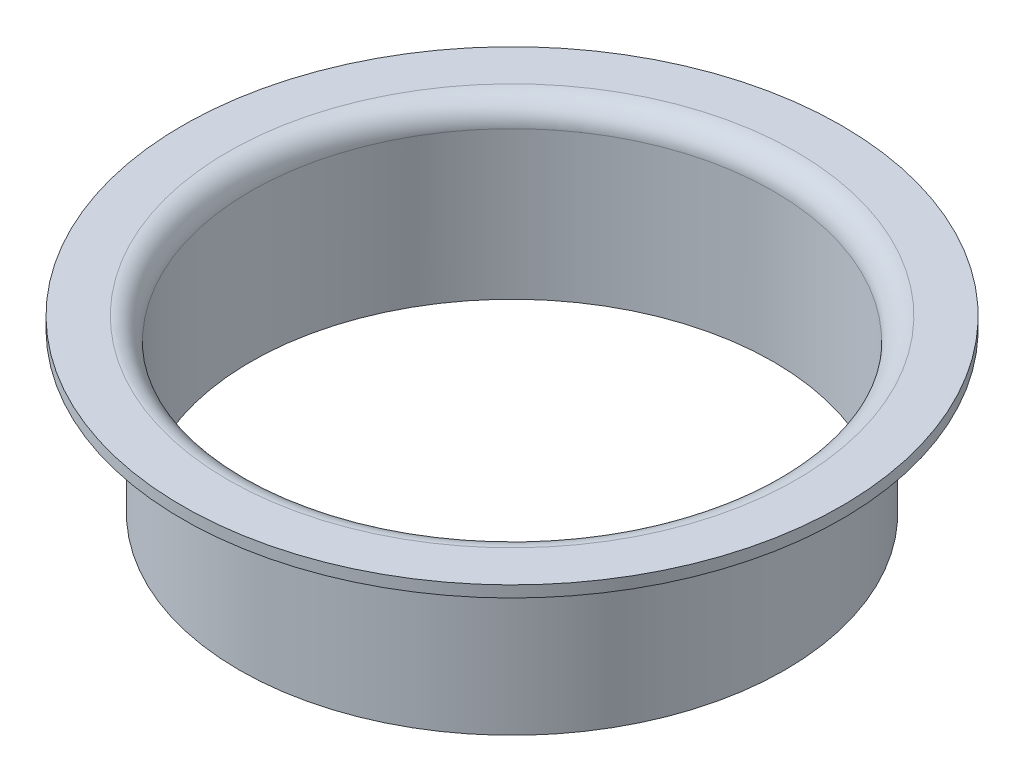
ISO-10303-21;
HEADER;
FILE_DESCRIPTION(('STEP AP214'),'2;1');
FILE_NAME('part.step','',(''),(''),'','','');
FILE_SCHEMA(('AUTOMOTIVE_DESIGN { 1 0 10303 214 1 1 1 1 }'));
ENDSEC;
DATA;
#1=APPLICATION_CONTEXT('core data for automotive mechanical design processes');
#2=APPLICATION_PROTOCOL_DEFINITION('international standard','automotive_design',2000,#1);
#3=PRODUCT_CONTEXT('',#1,'mechanical');
#4=PRODUCT('Part','Part','',(#3));
#5=PRODUCT_RELATED_PRODUCT_CATEGORY('part','',(#4));
#6=PRODUCT_DEFINITION_FORMATION('','',#4);
#7=PRODUCT_DEFINITION_CONTEXT('part definition',#1,'design');
#8=PRODUCT_DEFINITION('design','',#6,#7);
#9=PRODUCT_DEFINITION_SHAPE('','',#8);
#10=(LENGTH_UNIT() NAMED_UNIT(*) SI_UNIT(.MILLI.,.METRE.));
#11=(NAMED_UNIT(*) PLANE_ANGLE_UNIT() SI_UNIT($,.RADIAN.));
#12=(NAMED_UNIT(*) SI_UNIT($,.STERADIAN.) SOLID_ANGLE_UNIT());
#13=UNCERTAINTY_MEASURE_WITH_UNIT(LENGTH_MEASURE(1.E-05),#10,'distance_accuracy_value','');
#14=(GEOMETRIC_REPRESENTATION_CONTEXT(3) GLOBAL_UNCERTAINTY_ASSIGNED_CONTEXT((#13)) GLOBAL_UNIT_ASSIGNED_CONTEXT((#10,
#11,#12)) REPRESENTATION_CONTEXT('',''));
#15=CARTESIAN_POINT('',(0.,0.,0.));
#16=DIRECTION('',(0.,0.,1.));
#17=DIRECTION('',(1.,0.,0.));
#18=AXIS2_PLACEMENT_3D('',#15,#16,#17);
#19=CARTESIAN_POINT('',(29.21,0.,0.));
#20=DIRECTION('',(0.,-1.,0.));
#21=DIRECTION('',(0.,0.,-1.));
#22=AXIS2_PLACEMENT_3D('',#19,#20,#21);
#23=PLANE('',#22);
#24=CARTESIAN_POINT('',(0.,0.,0.));
#25=DIRECTION('',(0.,-1.,0.));
#26=DIRECTION('',(0.,0.,-1.));
#27=AXIS2_PLACEMENT_3D('',#24,#25,#26);
#28=CIRCLE('',#27,30.48);
#29=CARTESIAN_POINT('',(0.,0.,-30.48));
#30=VERTEX_POINT('',#29);
#31=EDGE_CURVE('E69',#30,#30,#28,.T.);
#32=ORIENTED_EDGE('',*,*,#31,.T.);
#33=EDGE_LOOP('',(#32));
#34=FACE_BOUND('',#33,.T.);
#35=CARTESIAN_POINT('',(0.,0.,0.));
#36=DIRECTION('',(0.,-1.,0.));
#37=DIRECTION('',(0.,0.,-1.));
#38=AXIS2_PLACEMENT_3D('',#35,#36,#37);
#39=CIRCLE('',#38,29.21);
#40=CARTESIAN_POINT('',(0.,0.,-29.21));
#41=VERTEX_POINT('',#40);
#42=EDGE_CURVE('E50',#41,#41,#39,.T.);
#43=ORIENTED_EDGE('',*,*,#42,.F.);
#44=EDGE_LOOP('',(#43));
#45=FACE_BOUND('',#44,.T.);
#46=ADVANCED_FACE('F37',(#34,#45),#23,.T.);
#47=CARTESIAN_POINT('',(0.,0.,0.));
#48=DIRECTION('',(0.,-1.,0.));
#49=DIRECTION('',(0.,0.,-1.));
#50=AXIS2_PLACEMENT_3D('',#47,#48,#49);
#51=CYLINDRICAL_SURFACE('',#50,29.21);
#52=CARTESIAN_POINT('',(0.,16.51,0.));
#53=DIRECTION('',(0.,1.,0.));
#54=DIRECTION('',(0.,0.,1.));
#55=AXIS2_PLACEMENT_3D('',#52,#53,#54);
#56=CIRCLE('',#55,29.21);
#57=CARTESIAN_POINT('',(0.,16.51,29.21));
#58=VERTEX_POINT('',#57);
#59=EDGE_CURVE('E10',#58,#58,#56,.T.);
#60=ORIENTED_EDGE('',*,*,#59,.T.);
#61=EDGE_LOOP('',(#60));
#62=FACE_BOUND('',#61,.T.);
#63=ORIENTED_EDGE('',*,*,#42,.T.);
#64=EDGE_LOOP('',(#63));
#65=FACE_BOUND('',#64,.T.);
#66=ADVANCED_FACE('F90',(#62,#65),#51,.F.);
#67=CARTESIAN_POINT('',(29.21,19.05,0.));
#68=DIRECTION('',(0.,1.,0.));
#69=DIRECTION('',(0.,0.,1.));
#70=AXIS2_PLACEMENT_3D('',#67,#68,#69);
#71=PLANE('',#70);
#72=CARTESIAN_POINT('',(0.,19.05,0.));
#73=DIRECTION('',(0.,1.,0.));
#74=DIRECTION('',(0.,0.,1.));
#75=AXIS2_PLACEMENT_3D('',#72,#73,#74);
#76=CIRCLE('',#75,31.75);
#77=CARTESIAN_POINT('',(0.,19.05,31.75));
#78=VERTEX_POINT('',#77);
#79=EDGE_CURVE('E45',#78,#78,#76,.F.);
#80=ORIENTED_EDGE('',*,*,#79,.T.);
#81=EDGE_LOOP('',(#80));
#82=FACE_BOUND('',#81,.T.);
#83=CARTESIAN_POINT('',(0.,19.05,0.));
#84=DIRECTION('',(0.,-1.,0.));
#85=DIRECTION('',(0.,0.,-1.));
#86=AXIS2_PLACEMENT_3D('',#83,#84,#85);
#87=CIRCLE('',#86,36.83);
#88=CARTESIAN_POINT('',(0.,19.05,-36.83));
#89=VERTEX_POINT('',#88);
#90=EDGE_CURVE('E55',#89,#89,#87,.T.);
#91=ORIENTED_EDGE('',*,*,#90,.F.);
#92=EDGE_LOOP('',(#91));
#93=FACE_BOUND('',#92,.T.);
#94=ADVANCED_FACE('F94',(#82,#93),#71,.T.);
#95=CARTESIAN_POINT('',(0.,0.,0.));
#96=DIRECTION('',(0.,-1.,0.));
#97=DIRECTION('',(0.,0.,-1.));
#98=AXIS2_PLACEMENT_3D('',#95,#96,#97);
#99=CYLINDRICAL_SURFACE('',#98,36.83);
#100=ORIENTED_EDGE('',*,*,#90,.T.);
#101=EDGE_LOOP('',(#100));
#102=FACE_BOUND('',#101,.T.);
#103=CARTESIAN_POINT('',(0.,17.78,0.));
#104=DIRECTION('',(0.,-1.,0.));
#105=DIRECTION('',(0.,0.,-1.));
#106=AXIS2_PLACEMENT_3D('',#103,#104,#105);
#107=CIRCLE('',#106,36.83);
#108=CARTESIAN_POINT('',(0.,17.78,-36.83));
#109=VERTEX_POINT('',#108);
#110=EDGE_CURVE('E61',#109,#109,#107,.T.);
#111=ORIENTED_EDGE('',*,*,#110,.F.);
#112=EDGE_LOOP('',(#111));
#113=FACE_BOUND('',#112,.T.);
#114=ADVANCED_FACE('F86',(#102,#113),#99,.T.);
#115=CARTESIAN_POINT('',(36.83,17.78,0.));
#116=DIRECTION('',(0.,-1.,0.));
#117=DIRECTION('',(0.,0.,-1.));
#118=AXIS2_PLACEMENT_3D('',#115,#116,#117);
#119=PLANE('',#118);
#120=ORIENTED_EDGE('',*,*,#110,.T.);
#121=EDGE_LOOP('',(#120));
#122=FACE_BOUND('',#121,.T.);
#123=CARTESIAN_POINT('',(0.,17.78,0.));
#124=DIRECTION('',(0.,-1.,0.));
#125=DIRECTION('',(0.,0.,-1.));
#126=AXIS2_PLACEMENT_3D('',#123,#124,#125);
#127=CIRCLE('',#126,30.48);
#128=CARTESIAN_POINT('',(0.,17.78,-30.48));
#129=VERTEX_POINT('',#128);
#130=EDGE_CURVE('E65',#129,#129,#127,.T.);
#131=ORIENTED_EDGE('',*,*,#130,.F.);
#132=EDGE_LOOP('',(#131));
#133=FACE_BOUND('',#132,.T.);
#134=ADVANCED_FACE('F78',(#122,#133),#119,.T.);
#135=CARTESIAN_POINT('',(0.,0.,0.));
#136=DIRECTION('',(0.,-1.,0.));
#137=DIRECTION('',(0.,0.,-1.));
#138=AXIS2_PLACEMENT_3D('',#135,#136,#137);
#139=CYLINDRICAL_SURFACE('',#138,30.48);
#140=ORIENTED_EDGE('',*,*,#130,.T.);
#141=EDGE_LOOP('',(#140));
#142=FACE_BOUND('',#141,.T.);
#143=ORIENTED_EDGE('',*,*,#31,.F.);
#144=EDGE_LOOP('',(#143));
#145=FACE_BOUND('',#144,.T.);
#146=ADVANCED_FACE('F76',(#142,#145),#139,.T.);
#147=CARTESIAN_POINT('',(0.,16.51,0.));
#148=DIRECTION('',(0.,1.,0.));
#149=DIRECTION('',(0.,0.,1.));
#150=AXIS2_PLACEMENT_3D('',#147,#148,#149);
#151=TOROIDAL_SURFACE('',#150,31.75,2.54);
#152=ORIENTED_EDGE('',*,*,#59,.F.);
#153=EDGE_LOOP('',(#152));
#154=FACE_BOUND('',#153,.T.);
#155=ORIENTED_EDGE('',*,*,#79,.F.);
#156=EDGE_LOOP('',(#155));
#157=FACE_BOUND('',#156,.T.);
#158=ADVANCED_FACE('F39',(#154,#157),#151,.T.);
#159=CLOSED_SHELL('',(#46,#66,#94,#114,#134,#146,#158));
#160=MANIFOLD_SOLID_BREP('B2',#159);
#161=ADVANCED_BREP_SHAPE_REPRESENTATION('',(#18,#160),#14);
#162=SHAPE_DEFINITION_REPRESENTATION(#9,#161);
ENDSEC;
END-ISO-10303-21;
